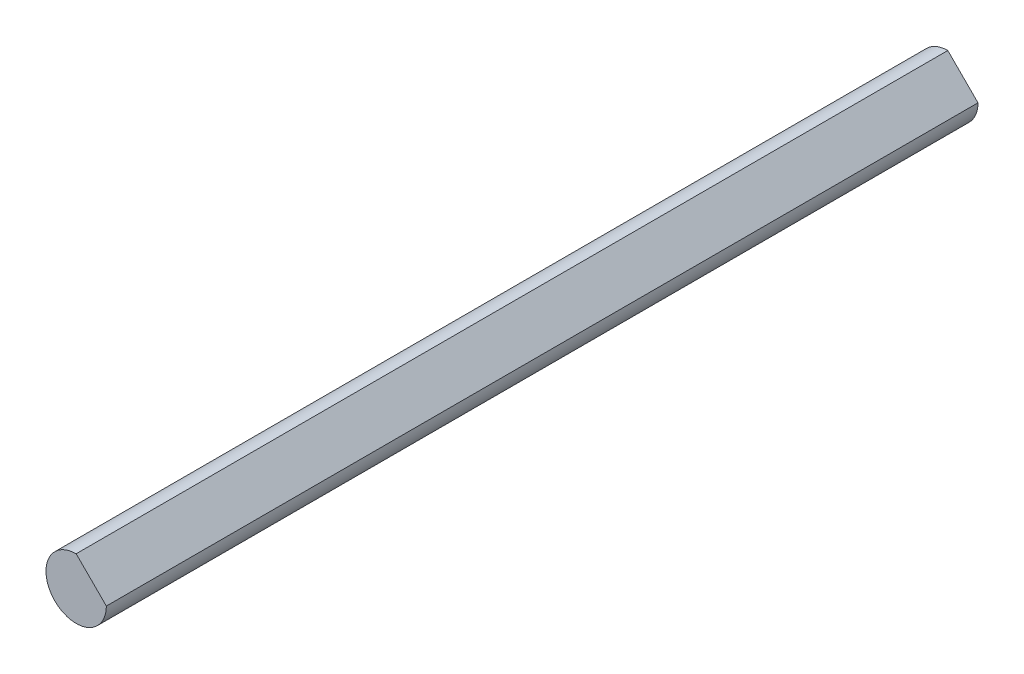
ISO-10303-21;
HEADER;
FILE_DESCRIPTION(('STEP AP214'),'2;1');
FILE_NAME('part.step','',(''),(''),'','','');
FILE_SCHEMA(('AUTOMOTIVE_DESIGN { 1 0 10303 214 1 1 1 1 }'));
ENDSEC;
DATA;
#1=APPLICATION_CONTEXT('core data for automotive mechanical design processes');
#2=APPLICATION_PROTOCOL_DEFINITION('international standard','automotive_design',2000,#1);
#3=PRODUCT_CONTEXT('',#1,'mechanical');
#4=PRODUCT('Part','Part','',(#3));
#5=PRODUCT_RELATED_PRODUCT_CATEGORY('part','',(#4));
#6=PRODUCT_DEFINITION_FORMATION('','',#4);
#7=PRODUCT_DEFINITION_CONTEXT('part definition',#1,'design');
#8=PRODUCT_DEFINITION('design','',#6,#7);
#9=PRODUCT_DEFINITION_SHAPE('','',#8);
#10=(LENGTH_UNIT() NAMED_UNIT(*) SI_UNIT(.MILLI.,.METRE.));
#11=(NAMED_UNIT(*) PLANE_ANGLE_UNIT() SI_UNIT($,.RADIAN.));
#12=(NAMED_UNIT(*) SI_UNIT($,.STERADIAN.) SOLID_ANGLE_UNIT());
#13=UNCERTAINTY_MEASURE_WITH_UNIT(LENGTH_MEASURE(1.E-05),#10,'distance_accuracy_value','');
#14=(GEOMETRIC_REPRESENTATION_CONTEXT(3) GLOBAL_UNCERTAINTY_ASSIGNED_CONTEXT((#13)) GLOBAL_UNIT_ASSIGNED_CONTEXT((#10,
#11,#12)) REPRESENTATION_CONTEXT('',''));
#15=CARTESIAN_POINT('',(0.,0.,0.));
#16=DIRECTION('',(0.,0.,1.));
#17=DIRECTION('',(1.,0.,0.));
#18=AXIS2_PLACEMENT_3D('',#15,#16,#17);
#19=CARTESIAN_POINT('',(0.,0.,110.));
#20=DIRECTION('',(0.,0.,-1.));
#21=DIRECTION('',(-1.,0.,0.));
#22=AXIS2_PLACEMENT_3D('',#19,#20,#21);
#23=CYLINDRICAL_SURFACE('',#22,3.81);
#24=CARTESIAN_POINT('',(0.,0.,110.));
#25=DIRECTION('',(0.,0.,1.));
#26=DIRECTION('',(1.,0.,0.));
#27=AXIS2_PLACEMENT_3D('',#24,#25,#26);
#28=CIRCLE('',#27,3.81);
#29=CARTESIAN_POINT('',(0.,3.81,110.));
#30=VERTEX_POINT('',#29);
#31=CARTESIAN_POINT('',(3.81,0.,110.));
#32=VERTEX_POINT('',#31);
#33=EDGE_CURVE('E11',#30,#32,#28,.T.);
#34=ORIENTED_EDGE('',*,*,#33,.F.);
#35=DIRECTION('',(0.,0.,1.));
#36=VECTOR('',#35,1.);
#37=CARTESIAN_POINT('',(0.,3.81,0.));
#38=LINE('',#37,#36);
#39=CARTESIAN_POINT('',(0.,3.81,0.));
#40=VERTEX_POINT('',#39);
#41=EDGE_CURVE('E59',#40,#30,#38,.T.);
#42=ORIENTED_EDGE('',*,*,#41,.F.);
#43=CARTESIAN_POINT('',(0.,0.,0.));
#44=DIRECTION('',(0.,0.,1.));
#45=DIRECTION('',(1.,0.,0.));
#46=AXIS2_PLACEMENT_3D('',#43,#44,#45);
#47=CIRCLE('',#46,3.81);
#48=CARTESIAN_POINT('',(3.81,0.,0.));
#49=VERTEX_POINT('',#48);
#50=EDGE_CURVE('E39',#40,#49,#47,.T.);
#51=ORIENTED_EDGE('',*,*,#50,.T.);
#52=DIRECTION('',(0.,0.,1.));
#53=VECTOR('',#52,1.);
#54=CARTESIAN_POINT('',(3.81,0.,0.));
#55=LINE('',#54,#53);
#56=EDGE_CURVE('E50',#49,#32,#55,.T.);
#57=ORIENTED_EDGE('',*,*,#56,.T.);
#58=EDGE_LOOP('',(#34,#42,#51,#57));
#59=FACE_BOUND('',#58,.T.);
#60=ADVANCED_FACE('F36',(#59),#23,.T.);
#61=CARTESIAN_POINT('',(0.,0.,110.));
#62=DIRECTION('',(0.,0.,1.));
#63=DIRECTION('',(1.,0.,0.));
#64=AXIS2_PLACEMENT_3D('',#61,#62,#63);
#65=PLANE('',#64);
#66=DIRECTION('',(0.707106781186548,-0.707106781186548,0.));
#67=VECTOR('',#66,1.);
#68=CARTESIAN_POINT('',(1.905,1.905,110.));
#69=LINE('',#68,#67);
#70=EDGE_CURVE('E62',#30,#32,#69,.T.);
#71=ORIENTED_EDGE('',*,*,#70,.F.);
#72=ORIENTED_EDGE('',*,*,#33,.T.);
#73=EDGE_LOOP('',(#71,#72));
#74=FACE_BOUND('',#73,.T.);
#75=ADVANCED_FACE('F69',(#74),#65,.T.);
#76=CARTESIAN_POINT('',(0.,0.,0.));
#77=DIRECTION('',(0.,0.,1.));
#78=DIRECTION('',(1.,0.,0.));
#79=AXIS2_PLACEMENT_3D('',#76,#77,#78);
#80=PLANE('',#79);
#81=ORIENTED_EDGE('',*,*,#50,.F.);
#82=DIRECTION('',(0.707106781186548,-0.707106781186548,0.));
#83=VECTOR('',#82,1.);
#84=CARTESIAN_POINT('',(1.905,1.905,0.));
#85=LINE('',#84,#83);
#86=EDGE_CURVE('E55',#40,#49,#85,.T.);
#87=ORIENTED_EDGE('',*,*,#86,.T.);
#88=EDGE_LOOP('',(#81,#87));
#89=FACE_BOUND('',#88,.T.);
#90=ADVANCED_FACE('F74',(#89),#80,.F.);
#91=CARTESIAN_POINT('',(1.905,1.905,0.));
#92=DIRECTION('',(-0.707106781186548,-0.707106781186548,0.));
#93=DIRECTION('',(0.707106781186548,-0.707106781186548,0.));
#94=AXIS2_PLACEMENT_3D('',#91,#92,#93);
#95=PLANE('',#94);
#96=ORIENTED_EDGE('',*,*,#70,.T.);
#97=ORIENTED_EDGE('',*,*,#56,.F.);
#98=ORIENTED_EDGE('',*,*,#86,.F.);
#99=ORIENTED_EDGE('',*,*,#41,.T.);
#100=EDGE_LOOP('',(#96,#97,#98,#99));
#101=FACE_BOUND('',#100,.T.);
#102=ADVANCED_FACE('F61',(#101),#95,.F.);
#103=CLOSED_SHELL('',(#60,#75,#90,#102));
#104=MANIFOLD_SOLID_BREP('B2',#103);
#105=ADVANCED_BREP_SHAPE_REPRESENTATION('',(#18,#104),#14);
#106=SHAPE_DEFINITION_REPRESENTATION(#9,#105);
ENDSEC;
END-ISO-10303-21;
